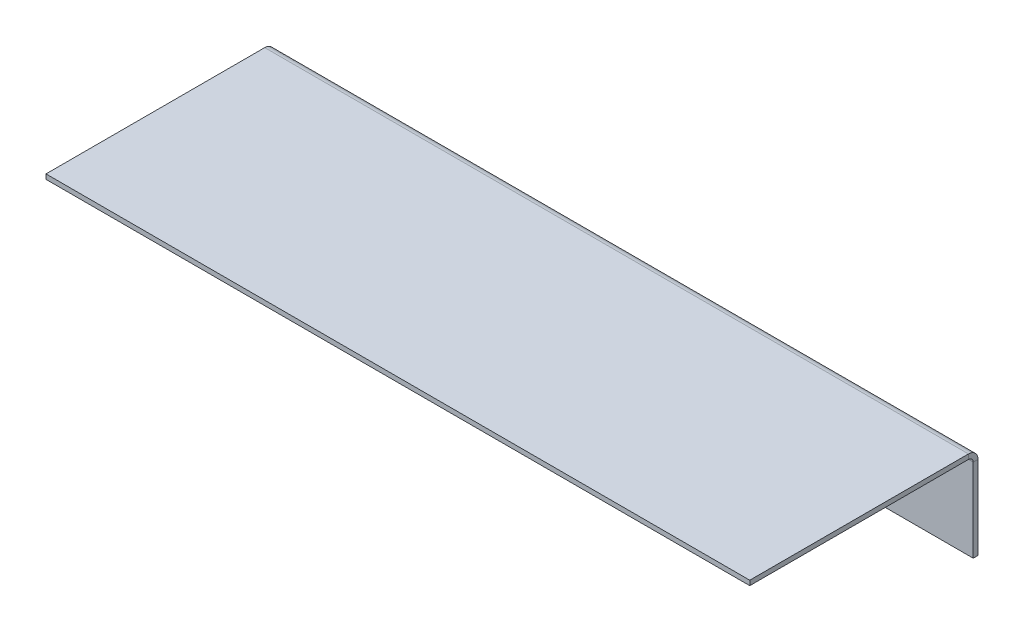
ISO-10303-21;
HEADER;
FILE_DESCRIPTION(('STEP AP214'),'2;1');
FILE_NAME('part.step','',(''),(''),'','','');
FILE_SCHEMA(('AUTOMOTIVE_DESIGN { 1 0 10303 214 1 1 1 1 }'));
ENDSEC;
DATA;
#1=APPLICATION_CONTEXT('core data for automotive mechanical design processes');
#2=APPLICATION_PROTOCOL_DEFINITION('international standard','automotive_design',2000,#1);
#3=PRODUCT_CONTEXT('',#1,'mechanical');
#4=PRODUCT('Part','Part','',(#3));
#5=PRODUCT_RELATED_PRODUCT_CATEGORY('part','',(#4));
#6=PRODUCT_DEFINITION_FORMATION('','',#4);
#7=PRODUCT_DEFINITION_CONTEXT('part definition',#1,'design');
#8=PRODUCT_DEFINITION('design','',#6,#7);
#9=PRODUCT_DEFINITION_SHAPE('','',#8);
#10=(LENGTH_UNIT() NAMED_UNIT(*) SI_UNIT(.MILLI.,.METRE.));
#11=(NAMED_UNIT(*) PLANE_ANGLE_UNIT() SI_UNIT($,.RADIAN.));
#12=(NAMED_UNIT(*) SI_UNIT($,.STERADIAN.) SOLID_ANGLE_UNIT());
#13=UNCERTAINTY_MEASURE_WITH_UNIT(LENGTH_MEASURE(1.E-05),#10,'distance_accuracy_value','');
#14=(GEOMETRIC_REPRESENTATION_CONTEXT(3) GLOBAL_UNCERTAINTY_ASSIGNED_CONTEXT((#13)) GLOBAL_UNIT_ASSIGNED_CONTEXT((#10,
#11,#12)) REPRESENTATION_CONTEXT('',''));
#15=CARTESIAN_POINT('',(0.,0.,0.));
#16=DIRECTION('',(0.,0.,1.));
#17=DIRECTION('',(1.,0.,0.));
#18=AXIS2_PLACEMENT_3D('',#15,#16,#17);
#19=CARTESIAN_POINT('',(0.,3.175,-146.05));
#20=DIRECTION('',(-1.,0.,0.));
#21=DIRECTION('',(0.,0.,1.));
#22=AXIS2_PLACEMENT_3D('',#19,#20,#21);
#23=PLANE('',#22);
#24=DIRECTION('',(0.,0.,1.));
#25=VECTOR('',#24,1.);
#26=CARTESIAN_POINT('',(0.,61.9125,0.));
#27=LINE('',#26,#25);
#28=CARTESIAN_POINT('',(0.,61.9125,-152.4));
#29=VERTEX_POINT('',#28);
#30=CARTESIAN_POINT('',(0.,61.9125,-149.225));
#31=VERTEX_POINT('',#30);
#32=EDGE_CURVE('E51',#29,#31,#27,.T.);
#33=ORIENTED_EDGE('',*,*,#32,.T.);
#34=DIRECTION('',(0.,1.,0.));
#35=VECTOR('',#34,1.);
#36=CARTESIAN_POINT('',(0.,0.,-149.225));
#37=LINE('',#36,#35);
#38=CARTESIAN_POINT('',(0.,117.475,-149.225));
#39=VERTEX_POINT('',#38);
#40=EDGE_CURVE('E156',#31,#39,#37,.T.);
#41=ORIENTED_EDGE('',*,*,#40,.T.);
#42=DIRECTION('',(0.,0.,-1.));
#43=VECTOR('',#42,1.);
#44=CARTESIAN_POINT('',(0.,117.475,-149.225));
#45=LINE('',#44,#43);
#46=CARTESIAN_POINT('',(0.,117.475,-152.4));
#47=VERTEX_POINT('',#46);
#48=EDGE_CURVE('E171',#39,#47,#45,.T.);
#49=ORIENTED_EDGE('',*,*,#48,.T.);
#50=DIRECTION('',(0.,1.,0.));
#51=VECTOR('',#50,1.);
#52=CARTESIAN_POINT('',(0.,0.,-152.4));
#53=LINE('',#52,#51);
#54=EDGE_CURVE('E158',#29,#47,#53,.T.);
#55=ORIENTED_EDGE('',*,*,#54,.F.);
#56=EDGE_LOOP('',(#33,#41,#49,#55));
#57=FACE_BOUND('',#56,.T.);
#58=ADVANCED_FACE('F37',(#57),#23,.T.);
#59=CARTESIAN_POINT('',(469.9,117.475,-152.4));
#60=DIRECTION('',(1.,0.,0.));
#61=DIRECTION('',(0.,0.,-1.));
#62=AXIS2_PLACEMENT_3D('',#59,#60,#61);
#63=PLANE('',#62);
#64=DIRECTION('',(0.,0.,1.));
#65=VECTOR('',#64,1.);
#66=CARTESIAN_POINT('',(469.9,117.475,-152.4));
#67=LINE('',#66,#65);
#68=CARTESIAN_POINT('',(469.9,117.475,-152.4));
#69=VERTEX_POINT('',#68);
#70=CARTESIAN_POINT('',(469.9,117.475,-149.225));
#71=VERTEX_POINT('',#70);
#72=EDGE_CURVE('E11',#69,#71,#67,.T.);
#73=ORIENTED_EDGE('',*,*,#72,.F.);
#74=CARTESIAN_POINT('',(469.9,117.475,-146.05));
#75=DIRECTION('',(-1.,0.,0.));
#76=DIRECTION('',(0.,0.,1.));
#77=AXIS2_PLACEMENT_3D('',#74,#75,#76);
#78=CIRCLE('',#77,6.35);
#79=CARTESIAN_POINT('',(469.9,123.825,-146.05));
#80=VERTEX_POINT('',#79);
#81=EDGE_CURVE('E143',#69,#80,#78,.F.);
#82=ORIENTED_EDGE('',*,*,#81,.T.);
#83=DIRECTION('',(0.,1.,0.));
#84=VECTOR('',#83,1.);
#85=CARTESIAN_POINT('',(469.9,120.65,-146.05));
#86=LINE('',#85,#84);
#87=CARTESIAN_POINT('',(469.9,120.65,-146.05));
#88=VERTEX_POINT('',#87);
#89=EDGE_CURVE('E44',#88,#80,#86,.T.);
#90=ORIENTED_EDGE('',*,*,#89,.F.);
#91=CARTESIAN_POINT('',(469.9,117.475,-146.05));
#92=DIRECTION('',(1.,0.,0.));
#93=DIRECTION('',(0.,0.,-1.));
#94=AXIS2_PLACEMENT_3D('',#91,#92,#93);
#95=CIRCLE('',#94,3.175);
#96=EDGE_CURVE('E117',#71,#88,#95,.T.);
#97=ORIENTED_EDGE('',*,*,#96,.F.);
#98=EDGE_LOOP('',(#73,#82,#90,#97));
#99=FACE_BOUND('',#98,.T.);
#100=ADVANCED_FACE('F133',(#99),#63,.T.);
#101=CARTESIAN_POINT('',(469.9,120.65,-146.05));
#102=DIRECTION('',(1.,0.,0.));
#103=DIRECTION('',(0.,0.,-1.));
#104=AXIS2_PLACEMENT_3D('',#101,#102,#103);
#105=PLANE('',#104);
#106=DIRECTION('',(0.,0.,1.));
#107=VECTOR('',#106,1.);
#108=CARTESIAN_POINT('',(469.9,61.9125,0.));
#109=LINE('',#108,#107);
#110=CARTESIAN_POINT('',(469.9,61.9125,-152.4));
#111=VERTEX_POINT('',#110);
#112=CARTESIAN_POINT('',(469.9,61.9125,-149.225));
#113=VERTEX_POINT('',#112);
#114=EDGE_CURVE('E196',#111,#113,#109,.T.);
#115=ORIENTED_EDGE('',*,*,#114,.F.);
#116=DIRECTION('',(0.,1.,0.));
#117=VECTOR('',#116,1.);
#118=CARTESIAN_POINT('',(469.9,0.,-152.4));
#119=LINE('',#118,#117);
#120=EDGE_CURVE('E116',#111,#69,#119,.T.);
#121=ORIENTED_EDGE('',*,*,#120,.T.);
#122=ORIENTED_EDGE('',*,*,#72,.T.);
#123=DIRECTION('',(0.,1.,0.));
#124=VECTOR('',#123,1.);
#125=CARTESIAN_POINT('',(469.9,0.,-149.225));
#126=LINE('',#125,#124);
#127=EDGE_CURVE('E106',#113,#71,#126,.T.);
#128=ORIENTED_EDGE('',*,*,#127,.F.);
#129=EDGE_LOOP('',(#115,#121,#122,#128));
#130=FACE_BOUND('',#129,.T.);
#131=ADVANCED_FACE('F120',(#130),#105,.T.);
#132=CARTESIAN_POINT('',(0.,123.825,-146.05));
#133=DIRECTION('',(-1.,0.,0.));
#134=DIRECTION('',(0.,0.,1.));
#135=AXIS2_PLACEMENT_3D('',#132,#133,#134);
#136=PLANE('',#135);
#137=DIRECTION('',(0.,-1.,0.));
#138=VECTOR('',#137,1.);
#139=CARTESIAN_POINT('',(0.,123.825,-146.05));
#140=LINE('',#139,#138);
#141=CARTESIAN_POINT('',(0.,123.825,-146.05));
#142=VERTEX_POINT('',#141);
#143=CARTESIAN_POINT('',(0.,120.65,-146.05));
#144=VERTEX_POINT('',#143);
#145=EDGE_CURVE('E87',#142,#144,#140,.T.);
#146=ORIENTED_EDGE('',*,*,#145,.F.);
#147=CARTESIAN_POINT('',(0.,117.475,-146.05));
#148=DIRECTION('',(-1.,0.,0.));
#149=DIRECTION('',(0.,0.,1.));
#150=AXIS2_PLACEMENT_3D('',#147,#148,#149);
#151=CIRCLE('',#150,6.35);
#152=EDGE_CURVE('E160',#47,#142,#151,.F.);
#153=ORIENTED_EDGE('',*,*,#152,.F.);
#154=ORIENTED_EDGE('',*,*,#48,.F.);
#155=CARTESIAN_POINT('',(0.,117.475,-146.05));
#156=DIRECTION('',(1.,0.,0.));
#157=DIRECTION('',(0.,0.,-1.));
#158=AXIS2_PLACEMENT_3D('',#155,#156,#157);
#159=CIRCLE('',#158,3.175);
#160=EDGE_CURVE('E129',#39,#144,#159,.T.);
#161=ORIENTED_EDGE('',*,*,#160,.T.);
#162=EDGE_LOOP('',(#146,#153,#154,#161));
#163=FACE_BOUND('',#162,.T.);
#164=ADVANCED_FACE('F182',(#163),#136,.T.);
#165=CARTESIAN_POINT('',(0.,117.475,-149.225));
#166=DIRECTION('',(-1.,0.,0.));
#167=DIRECTION('',(0.,0.,1.));
#168=AXIS2_PLACEMENT_3D('',#165,#166,#167);
#169=PLANE('',#168);
#170=DIRECTION('',(0.,0.,1.));
#171=VECTOR('',#170,1.);
#172=CARTESIAN_POINT('',(0.,123.825,-152.4));
#173=LINE('',#172,#171);
#174=CARTESIAN_POINT('',(0.,123.825,0.));
#175=VERTEX_POINT('',#174);
#176=EDGE_CURVE('E146',#142,#175,#173,.T.);
#177=ORIENTED_EDGE('',*,*,#176,.F.);
#178=ORIENTED_EDGE('',*,*,#145,.T.);
#179=DIRECTION('',(0.,0.,-1.));
#180=VECTOR('',#179,1.);
#181=CARTESIAN_POINT('',(0.,120.65,-152.4));
#182=LINE('',#181,#180);
#183=CARTESIAN_POINT('',(0.,120.65,0.));
#184=VERTEX_POINT('',#183);
#185=EDGE_CURVE('E152',#144,#184,#182,.F.);
#186=ORIENTED_EDGE('',*,*,#185,.T.);
#187=DIRECTION('',(0.,1.,0.));
#188=VECTOR('',#187,1.);
#189=CARTESIAN_POINT('',(0.,120.65,0.));
#190=LINE('',#189,#188);
#191=EDGE_CURVE('E149',#184,#175,#190,.T.);
#192=ORIENTED_EDGE('',*,*,#191,.T.);
#193=EDGE_LOOP('',(#177,#178,#186,#192));
#194=FACE_BOUND('',#193,.T.);
#195=ADVANCED_FACE('F176',(#194),#169,.T.);
#196=CARTESIAN_POINT('',(469.9,123.825,-152.4));
#197=DIRECTION('',(0.,-1.,0.));
#198=DIRECTION('',(0.,0.,-1.));
#199=AXIS2_PLACEMENT_3D('',#196,#197,#198);
#200=PLANE('',#199);
#201=ORIENTED_EDGE('',*,*,#176,.T.);
#202=DIRECTION('',(-1.,0.,0.));
#203=VECTOR('',#202,1.);
#204=CARTESIAN_POINT('',(469.9,123.825,0.));
#205=LINE('',#204,#203);
#206=CARTESIAN_POINT('',(469.9,123.825,0.));
#207=VERTEX_POINT('',#206);
#208=EDGE_CURVE('E169',#207,#175,#205,.T.);
#209=ORIENTED_EDGE('',*,*,#208,.F.);
#210=DIRECTION('',(0.,0.,1.));
#211=VECTOR('',#210,1.);
#212=CARTESIAN_POINT('',(469.9,123.825,-152.4));
#213=LINE('',#212,#211);
#214=EDGE_CURVE('E93',#80,#207,#213,.T.);
#215=ORIENTED_EDGE('',*,*,#214,.F.);
#216=DIRECTION('',(-1.,0.,0.));
#217=VECTOR('',#216,1.);
#218=CARTESIAN_POINT('',(469.9,123.825,-146.05));
#219=LINE('',#218,#217);
#220=EDGE_CURVE('E145',#80,#142,#219,.T.);
#221=ORIENTED_EDGE('',*,*,#220,.T.);
#222=EDGE_LOOP('',(#201,#209,#215,#221));
#223=FACE_BOUND('',#222,.T.);
#224=ADVANCED_FACE('F226',(#223),#200,.F.);
#225=CARTESIAN_POINT('',(469.9,120.65,0.));
#226=DIRECTION('',(0.,0.,1.));
#227=DIRECTION('',(0.,-1.,0.));
#228=AXIS2_PLACEMENT_3D('',#225,#226,#227);
#229=PLANE('',#228);
#230=ORIENTED_EDGE('',*,*,#191,.F.);
#231=DIRECTION('',(-1.,0.,0.));
#232=VECTOR('',#231,1.);
#233=CARTESIAN_POINT('',(469.9,120.65,0.));
#234=LINE('',#233,#232);
#235=CARTESIAN_POINT('',(469.9,120.65,0.));
#236=VERTEX_POINT('',#235);
#237=EDGE_CURVE('E167',#236,#184,#234,.T.);
#238=ORIENTED_EDGE('',*,*,#237,.F.);
#239=DIRECTION('',(0.,1.,0.));
#240=VECTOR('',#239,1.);
#241=CARTESIAN_POINT('',(469.9,120.65,0.));
#242=LINE('',#241,#240);
#243=EDGE_CURVE('E138',#236,#207,#242,.T.);
#244=ORIENTED_EDGE('',*,*,#243,.T.);
#245=ORIENTED_EDGE('',*,*,#208,.T.);
#246=EDGE_LOOP('',(#230,#238,#244,#245));
#247=FACE_BOUND('',#246,.T.);
#248=ADVANCED_FACE('F202',(#247),#229,.T.);
#249=CARTESIAN_POINT('',(469.9,120.65,-152.4));
#250=DIRECTION('',(0.,-1.,0.));
#251=DIRECTION('',(0.,0.,-1.));
#252=AXIS2_PLACEMENT_3D('',#249,#250,#251);
#253=PLANE('',#252);
#254=ORIENTED_EDGE('',*,*,#185,.F.);
#255=DIRECTION('',(-1.,0.,0.));
#256=VECTOR('',#255,1.);
#257=CARTESIAN_POINT('',(469.9,120.65,-146.05));
#258=LINE('',#257,#256);
#259=EDGE_CURVE('E130',#88,#144,#258,.T.);
#260=ORIENTED_EDGE('',*,*,#259,.F.);
#261=DIRECTION('',(0.,0.,-1.));
#262=VECTOR('',#261,1.);
#263=CARTESIAN_POINT('',(469.9,120.65,-152.4));
#264=LINE('',#263,#262);
#265=EDGE_CURVE('E135',#88,#236,#264,.F.);
#266=ORIENTED_EDGE('',*,*,#265,.T.);
#267=ORIENTED_EDGE('',*,*,#237,.T.);
#268=EDGE_LOOP('',(#254,#260,#266,#267));
#269=FACE_BOUND('',#268,.T.);
#270=ADVANCED_FACE('F179',(#269),#253,.T.);
#271=CARTESIAN_POINT('',(469.9,117.475,-146.05));
#272=DIRECTION('',(-1.,0.,0.));
#273=DIRECTION('',(0.,0.,1.));
#274=AXIS2_PLACEMENT_3D('',#271,#272,#273);
#275=CYLINDRICAL_SURFACE('',#274,3.175);
#276=ORIENTED_EDGE('',*,*,#160,.F.);
#277=DIRECTION('',(-1.,0.,0.));
#278=VECTOR('',#277,1.);
#279=CARTESIAN_POINT('',(469.9,117.475,-149.225));
#280=LINE('',#279,#278);
#281=EDGE_CURVE('E110',#71,#39,#280,.T.);
#282=ORIENTED_EDGE('',*,*,#281,.F.);
#283=ORIENTED_EDGE('',*,*,#96,.T.);
#284=ORIENTED_EDGE('',*,*,#259,.T.);
#285=EDGE_LOOP('',(#276,#282,#283,#284));
#286=FACE_BOUND('',#285,.T.);
#287=ADVANCED_FACE('F127',(#286),#275,.F.);
#288=CARTESIAN_POINT('',(469.9,0.,-149.225));
#289=DIRECTION('',(0.,0.,1.));
#290=DIRECTION('',(1.,0.,0.));
#291=AXIS2_PLACEMENT_3D('',#288,#289,#290);
#292=PLANE('',#291);
#293=DIRECTION('',(-1.,0.,0.));
#294=VECTOR('',#293,1.);
#295=CARTESIAN_POINT('',(469.9,61.9125,-149.225));
#296=LINE('',#295,#294);
#297=EDGE_CURVE('E113',#113,#31,#296,.T.);
#298=ORIENTED_EDGE('',*,*,#297,.F.);
#299=ORIENTED_EDGE('',*,*,#127,.T.);
#300=ORIENTED_EDGE('',*,*,#281,.T.);
#301=ORIENTED_EDGE('',*,*,#40,.F.);
#302=EDGE_LOOP('',(#298,#299,#300,#301));
#303=FACE_BOUND('',#302,.T.);
#304=ADVANCED_FACE('F107',(#303),#292,.T.);
#305=CARTESIAN_POINT('',(469.9,0.,-152.4));
#306=DIRECTION('',(0.,0.,1.));
#307=DIRECTION('',(1.,0.,0.));
#308=AXIS2_PLACEMENT_3D('',#305,#306,#307);
#309=PLANE('',#308);
#310=ORIENTED_EDGE('',*,*,#120,.F.);
#311=DIRECTION('',(1.,0.,0.));
#312=VECTOR('',#311,1.);
#313=CARTESIAN_POINT('',(0.,61.9125,-152.4));
#314=LINE('',#313,#312);
#315=EDGE_CURVE('E192',#29,#111,#314,.T.);
#316=ORIENTED_EDGE('',*,*,#315,.F.);
#317=ORIENTED_EDGE('',*,*,#54,.T.);
#318=DIRECTION('',(-1.,0.,0.));
#319=VECTOR('',#318,1.);
#320=CARTESIAN_POINT('',(469.9,117.475,-152.4));
#321=LINE('',#320,#319);
#322=EDGE_CURVE('E131',#69,#47,#321,.T.);
#323=ORIENTED_EDGE('',*,*,#322,.F.);
#324=EDGE_LOOP('',(#310,#316,#317,#323));
#325=FACE_BOUND('',#324,.T.);
#326=ADVANCED_FACE('F190',(#325),#309,.F.);
#327=CARTESIAN_POINT('',(469.9,117.475,-146.05));
#328=DIRECTION('',(-1.,0.,0.));
#329=DIRECTION('',(0.,0.,1.));
#330=AXIS2_PLACEMENT_3D('',#327,#328,#329);
#331=CYLINDRICAL_SURFACE('',#330,6.35);
#332=ORIENTED_EDGE('',*,*,#152,.T.);
#333=ORIENTED_EDGE('',*,*,#220,.F.);
#334=ORIENTED_EDGE('',*,*,#81,.F.);
#335=ORIENTED_EDGE('',*,*,#322,.T.);
#336=EDGE_LOOP('',(#332,#333,#334,#335));
#337=FACE_BOUND('',#336,.T.);
#338=ADVANCED_FACE('F187',(#337),#331,.T.);
#339=CARTESIAN_POINT('',(469.9,117.475,-146.05));
#340=DIRECTION('',(1.,0.,0.));
#341=DIRECTION('',(0.,0.,-1.));
#342=AXIS2_PLACEMENT_3D('',#339,#340,#341);
#343=PLANE('',#342);
#344=ORIENTED_EDGE('',*,*,#214,.T.);
#345=ORIENTED_EDGE('',*,*,#243,.F.);
#346=ORIENTED_EDGE('',*,*,#265,.F.);
#347=ORIENTED_EDGE('',*,*,#89,.T.);
#348=EDGE_LOOP('',(#344,#345,#346,#347));
#349=FACE_BOUND('',#348,.T.);
#350=ADVANCED_FACE('F203',(#349),#343,.T.);
#351=CARTESIAN_POINT('',(0.,61.9125,0.));
#352=DIRECTION('',(0.,1.,0.));
#353=DIRECTION('',(0.,0.,1.));
#354=AXIS2_PLACEMENT_3D('',#351,#352,#353);
#355=PLANE('',#354);
#356=ORIENTED_EDGE('',*,*,#297,.T.);
#357=ORIENTED_EDGE('',*,*,#32,.F.);
#358=ORIENTED_EDGE('',*,*,#315,.T.);
#359=ORIENTED_EDGE('',*,*,#114,.T.);
#360=EDGE_LOOP('',(#356,#357,#358,#359));
#361=FACE_BOUND('',#360,.T.);
#362=ADVANCED_FACE('F205',(#361),#355,.F.);
#363=CLOSED_SHELL('',(#58,#100,#131,#164,#195,#224,#248,#270,#287,#304,#326,#338,#350,#362));
#364=MANIFOLD_SOLID_BREP('B2',#363);
#365=ADVANCED_BREP_SHAPE_REPRESENTATION('',(#18,#364),#14);
#366=SHAPE_DEFINITION_REPRESENTATION(#9,#365);
ENDSEC;
END-ISO-10303-21;
